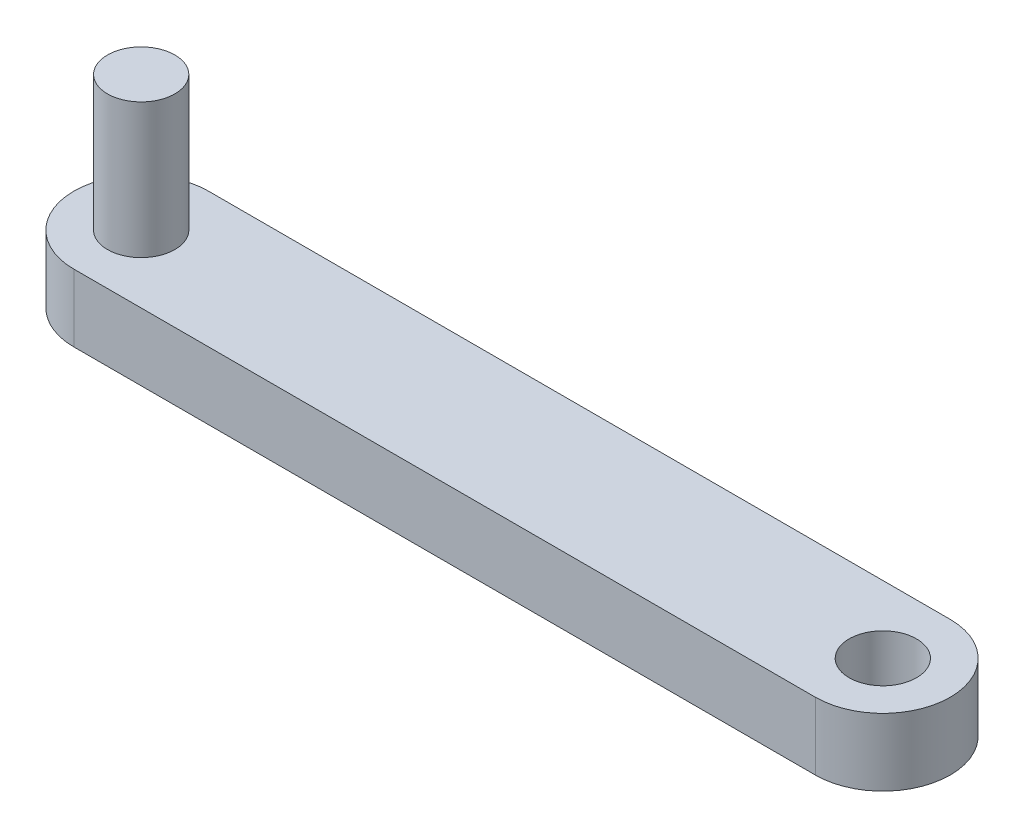
ISO-10303-21;
HEADER;
FILE_DESCRIPTION(('STEP AP214'),'2;1');
FILE_NAME('part.step','',(''),(''),'','','');
FILE_SCHEMA(('AUTOMOTIVE_DESIGN { 1 0 10303 214 1 1 1 1 }'));
ENDSEC;
DATA;
#1=APPLICATION_CONTEXT('core data for automotive mechanical design processes');
#2=APPLICATION_PROTOCOL_DEFINITION('international standard','automotive_design',2000,#1);
#3=PRODUCT_CONTEXT('',#1,'mechanical');
#4=PRODUCT('Part','Part','',(#3));
#5=PRODUCT_RELATED_PRODUCT_CATEGORY('part','',(#4));
#6=PRODUCT_DEFINITION_FORMATION('','',#4);
#7=PRODUCT_DEFINITION_CONTEXT('part definition',#1,'design');
#8=PRODUCT_DEFINITION('design','',#6,#7);
#9=PRODUCT_DEFINITION_SHAPE('','',#8);
#10=(LENGTH_UNIT() NAMED_UNIT(*) SI_UNIT(.MILLI.,.METRE.));
#11=(NAMED_UNIT(*) PLANE_ANGLE_UNIT() SI_UNIT($,.RADIAN.));
#12=(NAMED_UNIT(*) SI_UNIT($,.STERADIAN.) SOLID_ANGLE_UNIT());
#13=UNCERTAINTY_MEASURE_WITH_UNIT(LENGTH_MEASURE(1.E-05),#10,'distance_accuracy_value','');
#14=(GEOMETRIC_REPRESENTATION_CONTEXT(3) GLOBAL_UNCERTAINTY_ASSIGNED_CONTEXT((#13)) GLOBAL_UNIT_ASSIGNED_CONTEXT((#10,
#11,#12)) REPRESENTATION_CONTEXT('',''));
#15=CARTESIAN_POINT('',(0.,0.,0.));
#16=DIRECTION('',(0.,0.,1.));
#17=DIRECTION('',(1.,0.,0.));
#18=AXIS2_PLACEMENT_3D('',#15,#16,#17);
#19=CARTESIAN_POINT('',(55.,5.,0.));
#20=DIRECTION('',(0.,-1.,0.));
#21=DIRECTION('',(0.,0.,-1.));
#22=AXIS2_PLACEMENT_3D('',#19,#20,#21);
#23=PLANE('',#22);
#24=CARTESIAN_POINT('',(55.,5.,0.));
#25=DIRECTION('',(0.,1.,0.));
#26=DIRECTION('',(0.,0.,-1.));
#27=AXIS2_PLACEMENT_3D('',#24,#25,#26);
#28=CIRCLE('',#27,10.);
#29=CARTESIAN_POINT('',(55.,5.,10.));
#30=VERTEX_POINT('',#29);
#31=CARTESIAN_POINT('',(55.,5.,-10.));
#32=VERTEX_POINT('',#31);
#33=EDGE_CURVE('E92',#30,#32,#28,.T.);
#34=ORIENTED_EDGE('',*,*,#33,.T.);
#35=DIRECTION('',(-1.,0.,0.));
#36=VECTOR('',#35,1.);
#37=CARTESIAN_POINT('',(-55.,5.,-10.));
#38=LINE('',#37,#36);
#39=CARTESIAN_POINT('',(-55.,5.,-10.));
#40=VERTEX_POINT('',#39);
#41=EDGE_CURVE('E87',#32,#40,#38,.T.);
#42=ORIENTED_EDGE('',*,*,#41,.T.);
#43=CARTESIAN_POINT('',(-55.,5.,0.));
#44=DIRECTION('',(0.,1.,0.));
#45=DIRECTION('',(0.,0.,1.));
#46=AXIS2_PLACEMENT_3D('',#43,#44,#45);
#47=CIRCLE('',#46,10.);
#48=CARTESIAN_POINT('',(-55.,5.,10.));
#49=VERTEX_POINT('',#48);
#50=EDGE_CURVE('E90',#40,#49,#47,.T.);
#51=ORIENTED_EDGE('',*,*,#50,.T.);
#52=DIRECTION('',(1.,0.,0.));
#53=VECTOR('',#52,1.);
#54=CARTESIAN_POINT('',(-55.,5.,10.));
#55=LINE('',#54,#53);
#56=EDGE_CURVE('E57',#49,#30,#55,.T.);
#57=ORIENTED_EDGE('',*,*,#56,.T.);
#58=EDGE_LOOP('',(#34,#42,#51,#57));
#59=FACE_BOUND('',#58,.T.);
#60=CARTESIAN_POINT('',(-55.,5.,0.));
#61=DIRECTION('',(0.,1.,0.));
#62=DIRECTION('',(0.,0.,1.));
#63=AXIS2_PLACEMENT_3D('',#60,#61,#62);
#64=CIRCLE('',#63,5.);
#65=CARTESIAN_POINT('',(-55.,5.,5.));
#66=VERTEX_POINT('',#65);
#67=EDGE_CURVE('E112',#66,#66,#64,.T.);
#68=ORIENTED_EDGE('',*,*,#67,.F.);
#69=EDGE_LOOP('',(#68));
#70=FACE_BOUND('',#69,.T.);
#71=CARTESIAN_POINT('',(55.,5.,0.));
#72=DIRECTION('',(0.,1.,0.));
#73=DIRECTION('',(0.,0.,1.));
#74=AXIS2_PLACEMENT_3D('',#71,#72,#73);
#75=CIRCLE('',#74,5.);
#76=CARTESIAN_POINT('',(55.,5.,5.));
#77=VERTEX_POINT('',#76);
#78=EDGE_CURVE('E133',#77,#77,#75,.T.);
#79=ORIENTED_EDGE('',*,*,#78,.F.);
#80=EDGE_LOOP('',(#79));
#81=FACE_BOUND('',#80,.T.);
#82=ADVANCED_FACE('F39',(#59,#70,#81),#23,.F.);
#83=CARTESIAN_POINT('',(55.,-5.,0.));
#84=DIRECTION('',(0.,-1.,0.));
#85=DIRECTION('',(0.,0.,-1.));
#86=AXIS2_PLACEMENT_3D('',#83,#84,#85);
#87=PLANE('',#86);
#88=CARTESIAN_POINT('',(55.,-5.,0.));
#89=DIRECTION('',(0.,1.,0.));
#90=DIRECTION('',(0.,0.,-1.));
#91=AXIS2_PLACEMENT_3D('',#88,#89,#90);
#92=CIRCLE('',#91,10.);
#93=CARTESIAN_POINT('',(55.,-5.,10.));
#94=VERTEX_POINT('',#93);
#95=CARTESIAN_POINT('',(55.,-5.,-10.));
#96=VERTEX_POINT('',#95);
#97=EDGE_CURVE('E108',#94,#96,#92,.T.);
#98=ORIENTED_EDGE('',*,*,#97,.F.);
#99=DIRECTION('',(1.,0.,0.));
#100=VECTOR('',#99,1.);
#101=CARTESIAN_POINT('',(-55.,-5.,10.));
#102=LINE('',#101,#100);
#103=CARTESIAN_POINT('',(-55.,-5.,10.));
#104=VERTEX_POINT('',#103);
#105=EDGE_CURVE('E80',#104,#94,#102,.T.);
#106=ORIENTED_EDGE('',*,*,#105,.F.);
#107=CARTESIAN_POINT('',(-55.,-5.,0.));
#108=DIRECTION('',(0.,1.,0.));
#109=DIRECTION('',(0.,0.,1.));
#110=AXIS2_PLACEMENT_3D('',#107,#108,#109);
#111=CIRCLE('',#110,10.);
#112=CARTESIAN_POINT('',(-55.,-5.,-10.));
#113=VERTEX_POINT('',#112);
#114=EDGE_CURVE('E74',#113,#104,#111,.T.);
#115=ORIENTED_EDGE('',*,*,#114,.F.);
#116=DIRECTION('',(-1.,0.,0.));
#117=VECTOR('',#116,1.);
#118=CARTESIAN_POINT('',(-55.,-5.,-10.));
#119=LINE('',#118,#117);
#120=EDGE_CURVE('E97',#96,#113,#119,.T.);
#121=ORIENTED_EDGE('',*,*,#120,.F.);
#122=EDGE_LOOP('',(#98,#106,#115,#121));
#123=FACE_BOUND('',#122,.T.);
#124=CARTESIAN_POINT('',(55.,-5.,0.));
#125=DIRECTION('',(0.,1.,0.));
#126=DIRECTION('',(0.,0.,1.));
#127=AXIS2_PLACEMENT_3D('',#124,#125,#126);
#128=CIRCLE('',#127,5.);
#129=CARTESIAN_POINT('',(55.,-5.,5.));
#130=VERTEX_POINT('',#129);
#131=EDGE_CURVE('E134',#130,#130,#128,.T.);
#132=ORIENTED_EDGE('',*,*,#131,.T.);
#133=EDGE_LOOP('',(#132));
#134=FACE_BOUND('',#133,.T.);
#135=ADVANCED_FACE('F125',(#123,#134),#87,.T.);
#136=CARTESIAN_POINT('',(55.,5.,0.));
#137=DIRECTION('',(0.,-1.,0.));
#138=DIRECTION('',(0.,0.,-1.));
#139=AXIS2_PLACEMENT_3D('',#136,#137,#138);
#140=CYLINDRICAL_SURFACE('',#139,10.);
#141=ORIENTED_EDGE('',*,*,#97,.T.);
#142=DIRECTION('',(0.,-1.,0.));
#143=VECTOR('',#142,1.);
#144=CARTESIAN_POINT('',(55.,5.,-10.));
#145=LINE('',#144,#143);
#146=EDGE_CURVE('E11',#32,#96,#145,.T.);
#147=ORIENTED_EDGE('',*,*,#146,.F.);
#148=ORIENTED_EDGE('',*,*,#33,.F.);
#149=DIRECTION('',(0.,-1.,0.));
#150=VECTOR('',#149,1.);
#151=CARTESIAN_POINT('',(55.,5.,10.));
#152=LINE('',#151,#150);
#153=EDGE_CURVE('E104',#30,#94,#152,.T.);
#154=ORIENTED_EDGE('',*,*,#153,.T.);
#155=EDGE_LOOP('',(#141,#147,#148,#154));
#156=FACE_BOUND('',#155,.T.);
#157=ADVANCED_FACE('F41',(#156),#140,.T.);
#158=CARTESIAN_POINT('',(-55.,5.,-10.));
#159=DIRECTION('',(0.,0.,1.));
#160=DIRECTION('',(1.,0.,0.));
#161=AXIS2_PLACEMENT_3D('',#158,#159,#160);
#162=PLANE('',#161);
#163=ORIENTED_EDGE('',*,*,#120,.T.);
#164=DIRECTION('',(0.,-1.,0.));
#165=VECTOR('',#164,1.);
#166=CARTESIAN_POINT('',(-55.,5.,-10.));
#167=LINE('',#166,#165);
#168=EDGE_CURVE('E49',#40,#113,#167,.T.);
#169=ORIENTED_EDGE('',*,*,#168,.F.);
#170=ORIENTED_EDGE('',*,*,#41,.F.);
#171=ORIENTED_EDGE('',*,*,#146,.T.);
#172=EDGE_LOOP('',(#163,#169,#170,#171));
#173=FACE_BOUND('',#172,.T.);
#174=ADVANCED_FACE('F96',(#173),#162,.F.);
#175=CARTESIAN_POINT('',(-55.,5.,0.));
#176=DIRECTION('',(0.,-1.,0.));
#177=DIRECTION('',(0.,0.,-1.));
#178=AXIS2_PLACEMENT_3D('',#175,#176,#177);
#179=CYLINDRICAL_SURFACE('',#178,10.);
#180=ORIENTED_EDGE('',*,*,#114,.T.);
#181=DIRECTION('',(0.,-1.,0.));
#182=VECTOR('',#181,1.);
#183=CARTESIAN_POINT('',(-55.,5.,10.));
#184=LINE('',#183,#182);
#185=EDGE_CURVE('E99',#49,#104,#184,.T.);
#186=ORIENTED_EDGE('',*,*,#185,.F.);
#187=ORIENTED_EDGE('',*,*,#50,.F.);
#188=ORIENTED_EDGE('',*,*,#168,.T.);
#189=EDGE_LOOP('',(#180,#186,#187,#188));
#190=FACE_BOUND('',#189,.T.);
#191=ADVANCED_FACE('F100',(#190),#179,.T.);
#192=CARTESIAN_POINT('',(-55.,5.,10.));
#193=DIRECTION('',(0.,0.,-1.));
#194=DIRECTION('',(-1.,0.,0.));
#195=AXIS2_PLACEMENT_3D('',#192,#193,#194);
#196=PLANE('',#195);
#197=ORIENTED_EDGE('',*,*,#105,.T.);
#198=ORIENTED_EDGE('',*,*,#153,.F.);
#199=ORIENTED_EDGE('',*,*,#56,.F.);
#200=ORIENTED_EDGE('',*,*,#185,.T.);
#201=EDGE_LOOP('',(#197,#198,#199,#200));
#202=FACE_BOUND('',#201,.T.);
#203=ADVANCED_FACE('F122',(#202),#196,.F.);
#204=CARTESIAN_POINT('',(55.,5.,0.));
#205=DIRECTION('',(0.,-1.,0.));
#206=DIRECTION('',(0.,0.,-1.));
#207=AXIS2_PLACEMENT_3D('',#204,#205,#206);
#208=CYLINDRICAL_SURFACE('',#207,5.);
#209=ORIENTED_EDGE('',*,*,#78,.T.);
#210=EDGE_LOOP('',(#209));
#211=FACE_BOUND('',#210,.T.);
#212=ORIENTED_EDGE('',*,*,#131,.F.);
#213=EDGE_LOOP('',(#212));
#214=FACE_BOUND('',#213,.T.);
#215=ADVANCED_FACE('F151',(#211,#214),#208,.F.);
#216=CARTESIAN_POINT('',(-55.,-5.,0.));
#217=DIRECTION('',(0.,1.,0.));
#218=DIRECTION('',(0.,0.,1.));
#219=AXIS2_PLACEMENT_3D('',#216,#217,#218);
#220=CYLINDRICAL_SURFACE('',#219,5.);
#221=CARTESIAN_POINT('',(-55.,25.,0.));
#222=DIRECTION('',(0.,1.,0.));
#223=DIRECTION('',(0.,0.,1.));
#224=AXIS2_PLACEMENT_3D('',#221,#222,#223);
#225=CIRCLE('',#224,5.);
#226=CARTESIAN_POINT('',(-55.,25.,5.));
#227=VERTEX_POINT('',#226);
#228=EDGE_CURVE('E138',#227,#227,#225,.T.);
#229=ORIENTED_EDGE('',*,*,#228,.F.);
#230=EDGE_LOOP('',(#229));
#231=FACE_BOUND('',#230,.T.);
#232=ORIENTED_EDGE('',*,*,#67,.T.);
#233=EDGE_LOOP('',(#232));
#234=FACE_BOUND('',#233,.T.);
#235=ADVANCED_FACE('F148',(#231,#234),#220,.T.);
#236=CARTESIAN_POINT('',(-55.,25.,0.));
#237=DIRECTION('',(0.,1.,0.));
#238=DIRECTION('',(0.,0.,1.));
#239=AXIS2_PLACEMENT_3D('',#236,#237,#238);
#240=PLANE('',#239);
#241=ORIENTED_EDGE('',*,*,#228,.T.);
#242=EDGE_LOOP('',(#241));
#243=FACE_BOUND('',#242,.T.);
#244=ADVANCED_FACE('F146',(#243),#240,.T.);
#245=CLOSED_SHELL('',(#82,#135,#157,#174,#191,#203,#215,#235,#244));
#246=MANIFOLD_SOLID_BREP('B2',#245);
#247=ADVANCED_BREP_SHAPE_REPRESENTATION('',(#18,#246),#14);
#248=SHAPE_DEFINITION_REPRESENTATION(#9,#247);
ENDSEC;
END-ISO-10303-21;
